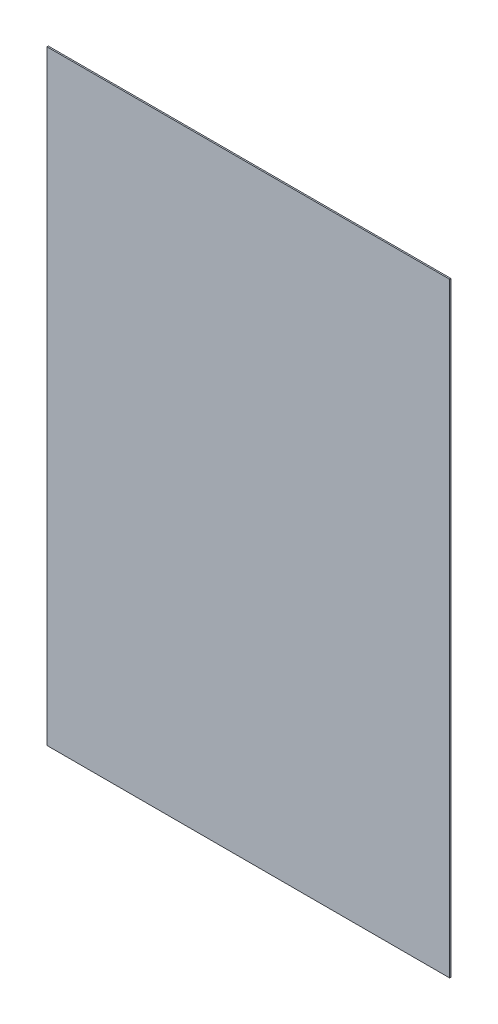
ISO-10303-21;
HEADER;
FILE_DESCRIPTION(('STEP AP214'),'2;1');
FILE_NAME('part.step','',(''),(''),'','','');
FILE_SCHEMA(('AUTOMOTIVE_DESIGN { 1 0 10303 214 1 1 1 1 }'));
ENDSEC;
DATA;
#1=APPLICATION_CONTEXT('core data for automotive mechanical design processes');
#2=APPLICATION_PROTOCOL_DEFINITION('international standard','automotive_design',2000,#1);
#3=PRODUCT_CONTEXT('',#1,'mechanical');
#4=PRODUCT('Part','Part','',(#3));
#5=PRODUCT_RELATED_PRODUCT_CATEGORY('part','',(#4));
#6=PRODUCT_DEFINITION_FORMATION('','',#4);
#7=PRODUCT_DEFINITION_CONTEXT('part definition',#1,'design');
#8=PRODUCT_DEFINITION('design','',#6,#7);
#9=PRODUCT_DEFINITION_SHAPE('','',#8);
#10=(LENGTH_UNIT() NAMED_UNIT(*) SI_UNIT(.MILLI.,.METRE.));
#11=(NAMED_UNIT(*) PLANE_ANGLE_UNIT() SI_UNIT($,.RADIAN.));
#12=(NAMED_UNIT(*) SI_UNIT($,.STERADIAN.) SOLID_ANGLE_UNIT());
#13=UNCERTAINTY_MEASURE_WITH_UNIT(LENGTH_MEASURE(1.E-05),#10,'distance_accuracy_value','');
#14=(GEOMETRIC_REPRESENTATION_CONTEXT(3) GLOBAL_UNCERTAINTY_ASSIGNED_CONTEXT((#13)) GLOBAL_UNIT_ASSIGNED_CONTEXT((#10,
#11,#12)) REPRESENTATION_CONTEXT('',''));
#15=CARTESIAN_POINT('',(0.,0.,0.));
#16=DIRECTION('',(0.,0.,1.));
#17=DIRECTION('',(1.,0.,0.));
#18=AXIS2_PLACEMENT_3D('',#15,#16,#17);
#19=CARTESIAN_POINT('',(-148.186199052147,222.661566191712,1.));
#20=DIRECTION('',(1.,0.,0.));
#21=DIRECTION('',(0.,0.,-1.));
#22=AXIS2_PLACEMENT_3D('',#19,#20,#21);
#23=PLANE('',#22);
#24=DIRECTION('',(0.,-1.,0.));
#25=VECTOR('',#24,1.);
#26=CARTESIAN_POINT('',(-148.186199052147,222.661566191712,0.));
#27=LINE('',#26,#25);
#28=CARTESIAN_POINT('',(-148.186199052147,222.661566191712,0.));
#29=VERTEX_POINT('',#28);
#30=CARTESIAN_POINT('',(-148.186199052147,-222.661566191712,0.));
#31=VERTEX_POINT('',#30);
#32=EDGE_CURVE('E95',#29,#31,#27,.T.);
#33=ORIENTED_EDGE('',*,*,#32,.T.);
#34=DIRECTION('',(0.,0.,-1.));
#35=VECTOR('',#34,1.);
#36=CARTESIAN_POINT('',(-148.186199052147,-222.661566191712,1.));
#37=LINE('',#36,#35);
#38=CARTESIAN_POINT('',(-148.186199052147,-222.661566191712,1.));
#39=VERTEX_POINT('',#38);
#40=EDGE_CURVE('E11',#39,#31,#37,.T.);
#41=ORIENTED_EDGE('',*,*,#40,.F.);
#42=DIRECTION('',(0.,-1.,0.));
#43=VECTOR('',#42,1.);
#44=CARTESIAN_POINT('',(-148.186199052147,222.661566191712,1.));
#45=LINE('',#44,#43);
#46=CARTESIAN_POINT('',(-148.186199052147,222.661566191712,1.));
#47=VERTEX_POINT('',#46);
#48=EDGE_CURVE('E83',#47,#39,#45,.T.);
#49=ORIENTED_EDGE('',*,*,#48,.F.);
#50=DIRECTION('',(0.,0.,-1.));
#51=VECTOR('',#50,1.);
#52=CARTESIAN_POINT('',(-148.186199052147,222.661566191712,1.));
#53=LINE('',#52,#51);
#54=EDGE_CURVE('E91',#47,#29,#53,.T.);
#55=ORIENTED_EDGE('',*,*,#54,.T.);
#56=EDGE_LOOP('',(#33,#41,#49,#55));
#57=FACE_BOUND('',#56,.T.);
#58=ADVANCED_FACE('F32',(#57),#23,.F.);
#59=CARTESIAN_POINT('',(148.186199052147,-222.661566191712,1.));
#60=DIRECTION('',(0.,1.,0.));
#61=DIRECTION('',(-1.,0.,0.));
#62=AXIS2_PLACEMENT_3D('',#59,#60,#61);
#63=PLANE('',#62);
#64=DIRECTION('',(1.,0.,0.));
#65=VECTOR('',#64,1.);
#66=CARTESIAN_POINT('',(148.186199052147,-222.661566191712,0.));
#67=LINE('',#66,#65);
#68=CARTESIAN_POINT('',(148.186199052147,-222.661566191712,0.));
#69=VERTEX_POINT('',#68);
#70=EDGE_CURVE('E87',#31,#69,#67,.T.);
#71=ORIENTED_EDGE('',*,*,#70,.T.);
#72=DIRECTION('',(0.,0.,-1.));
#73=VECTOR('',#72,1.);
#74=CARTESIAN_POINT('',(148.186199052147,-222.661566191712,1.));
#75=LINE('',#74,#73);
#76=CARTESIAN_POINT('',(148.186199052147,-222.661566191712,1.));
#77=VERTEX_POINT('',#76);
#78=EDGE_CURVE('E40',#77,#69,#75,.T.);
#79=ORIENTED_EDGE('',*,*,#78,.F.);
#80=DIRECTION('',(1.,0.,0.));
#81=VECTOR('',#80,1.);
#82=CARTESIAN_POINT('',(148.186199052147,-222.661566191712,1.));
#83=LINE('',#82,#81);
#84=EDGE_CURVE('E78',#39,#77,#83,.T.);
#85=ORIENTED_EDGE('',*,*,#84,.F.);
#86=ORIENTED_EDGE('',*,*,#40,.T.);
#87=EDGE_LOOP('',(#71,#79,#85,#86));
#88=FACE_BOUND('',#87,.T.);
#89=ADVANCED_FACE('F86',(#88),#63,.F.);
#90=CARTESIAN_POINT('',(148.186199052147,222.661566191712,1.));
#91=DIRECTION('',(-1.,0.,0.));
#92=DIRECTION('',(0.,0.,1.));
#93=AXIS2_PLACEMENT_3D('',#90,#91,#92);
#94=PLANE('',#93);
#95=DIRECTION('',(0.,1.,0.));
#96=VECTOR('',#95,1.);
#97=CARTESIAN_POINT('',(148.186199052147,222.661566191712,0.));
#98=LINE('',#97,#96);
#99=CARTESIAN_POINT('',(148.186199052147,222.661566191712,0.));
#100=VERTEX_POINT('',#99);
#101=EDGE_CURVE('E65',#69,#100,#98,.T.);
#102=ORIENTED_EDGE('',*,*,#101,.T.);
#103=DIRECTION('',(0.,0.,-1.));
#104=VECTOR('',#103,1.);
#105=CARTESIAN_POINT('',(148.186199052147,222.661566191712,1.));
#106=LINE('',#105,#104);
#107=CARTESIAN_POINT('',(148.186199052147,222.661566191712,1.));
#108=VERTEX_POINT('',#107);
#109=EDGE_CURVE('E88',#108,#100,#106,.T.);
#110=ORIENTED_EDGE('',*,*,#109,.F.);
#111=DIRECTION('',(0.,1.,0.));
#112=VECTOR('',#111,1.);
#113=CARTESIAN_POINT('',(148.186199052147,222.661566191712,1.));
#114=LINE('',#113,#112);
#115=EDGE_CURVE('E81',#77,#108,#114,.T.);
#116=ORIENTED_EDGE('',*,*,#115,.F.);
#117=ORIENTED_EDGE('',*,*,#78,.T.);
#118=EDGE_LOOP('',(#102,#110,#116,#117));
#119=FACE_BOUND('',#118,.T.);
#120=ADVANCED_FACE('F89',(#119),#94,.F.);
#121=CARTESIAN_POINT('',(148.186199052147,222.661566191712,1.));
#122=DIRECTION('',(0.,-1.,0.));
#123=DIRECTION('',(1.,0.,0.));
#124=AXIS2_PLACEMENT_3D('',#121,#122,#123);
#125=PLANE('',#124);
#126=DIRECTION('',(-1.,0.,0.));
#127=VECTOR('',#126,1.);
#128=CARTESIAN_POINT('',(148.186199052147,222.661566191712,0.));
#129=LINE('',#128,#127);
#130=EDGE_CURVE('E71',#100,#29,#129,.T.);
#131=ORIENTED_EDGE('',*,*,#130,.T.);
#132=ORIENTED_EDGE('',*,*,#54,.F.);
#133=DIRECTION('',(-1.,0.,0.));
#134=VECTOR('',#133,1.);
#135=CARTESIAN_POINT('',(148.186199052147,222.661566191712,1.));
#136=LINE('',#135,#134);
#137=EDGE_CURVE('E48',#108,#47,#136,.T.);
#138=ORIENTED_EDGE('',*,*,#137,.F.);
#139=ORIENTED_EDGE('',*,*,#109,.T.);
#140=EDGE_LOOP('',(#131,#132,#138,#139));
#141=FACE_BOUND('',#140,.T.);
#142=ADVANCED_FACE('F102',(#141),#125,.F.);
#143=CARTESIAN_POINT('',(0.,0.,1.));
#144=DIRECTION('',(0.,0.,-1.));
#145=DIRECTION('',(-1.,0.,0.));
#146=AXIS2_PLACEMENT_3D('',#143,#144,#145);
#147=PLANE('',#146);
#148=ORIENTED_EDGE('',*,*,#48,.T.);
#149=ORIENTED_EDGE('',*,*,#84,.T.);
#150=ORIENTED_EDGE('',*,*,#115,.T.);
#151=ORIENTED_EDGE('',*,*,#137,.T.);
#152=EDGE_LOOP('',(#148,#149,#150,#151));
#153=FACE_BOUND('',#152,.T.);
#154=ADVANCED_FACE('F79',(#153),#147,.F.);
#155=CARTESIAN_POINT('',(0.,0.,0.));
#156=DIRECTION('',(0.,0.,-1.));
#157=DIRECTION('',(-1.,0.,0.));
#158=AXIS2_PLACEMENT_3D('',#155,#156,#157);
#159=PLANE('',#158);
#160=ORIENTED_EDGE('',*,*,#32,.F.);
#161=ORIENTED_EDGE('',*,*,#130,.F.);
#162=ORIENTED_EDGE('',*,*,#101,.F.);
#163=ORIENTED_EDGE('',*,*,#70,.F.);
#164=EDGE_LOOP('',(#160,#161,#162,#163));
#165=FACE_BOUND('',#164,.T.);
#166=ADVANCED_FACE('F105',(#165),#159,.T.);
#167=CLOSED_SHELL('',(#58,#89,#120,#142,#154,#166));
#168=MANIFOLD_SOLID_BREP('B2',#167);
#169=ADVANCED_BREP_SHAPE_REPRESENTATION('',(#18,#168),#14);
#170=SHAPE_DEFINITION_REPRESENTATION(#9,#169);
ENDSEC;
END-ISO-10303-21;
